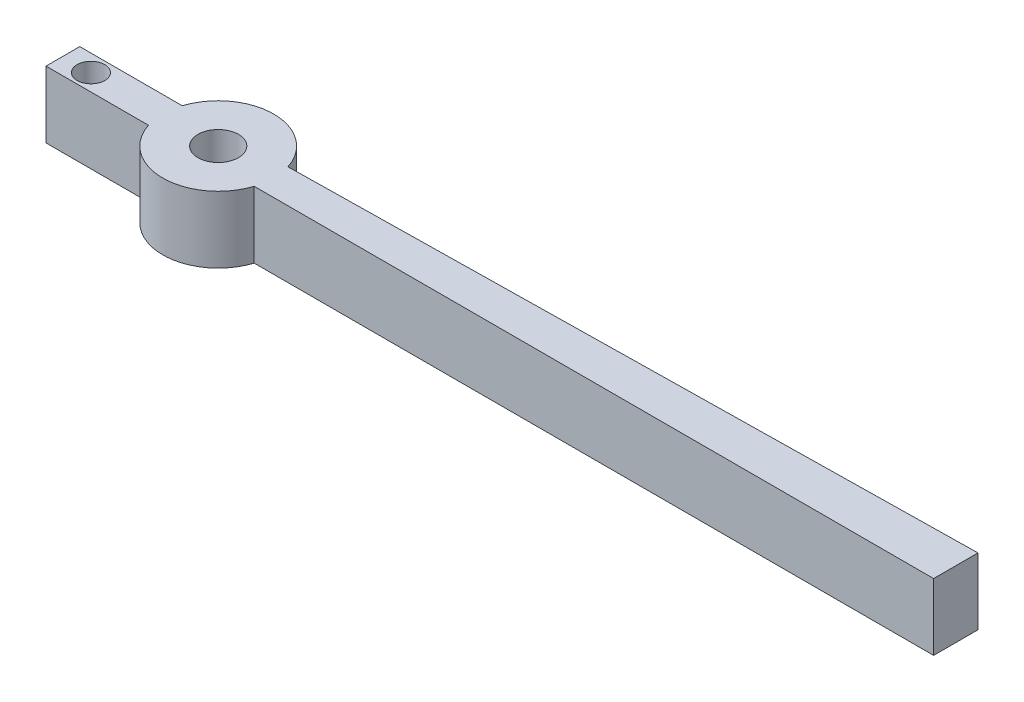
ISO-10303-21;
HEADER;
FILE_DESCRIPTION(('STEP AP214'),'2;1');
FILE_NAME('part.step','',(''),(''),'','','');
FILE_SCHEMA(('AUTOMOTIVE_DESIGN { 1 0 10303 214 1 1 1 1 }'));
ENDSEC;
DATA;
#1=APPLICATION_CONTEXT('core data for automotive mechanical design processes');
#2=APPLICATION_PROTOCOL_DEFINITION('international standard','automotive_design',2000,#1);
#3=PRODUCT_CONTEXT('',#1,'mechanical');
#4=PRODUCT('Part','Part','',(#3));
#5=PRODUCT_RELATED_PRODUCT_CATEGORY('part','',(#4));
#6=PRODUCT_DEFINITION_FORMATION('','',#4);
#7=PRODUCT_DEFINITION_CONTEXT('part definition',#1,'design');
#8=PRODUCT_DEFINITION('design','',#6,#7);
#9=PRODUCT_DEFINITION_SHAPE('','',#8);
#10=(LENGTH_UNIT() NAMED_UNIT(*) SI_UNIT(.MILLI.,.METRE.));
#11=(NAMED_UNIT(*) PLANE_ANGLE_UNIT() SI_UNIT($,.RADIAN.));
#12=(NAMED_UNIT(*) SI_UNIT($,.STERADIAN.) SOLID_ANGLE_UNIT());
#13=UNCERTAINTY_MEASURE_WITH_UNIT(LENGTH_MEASURE(1.E-05),#10,'distance_accuracy_value','');
#14=(GEOMETRIC_REPRESENTATION_CONTEXT(3) GLOBAL_UNCERTAINTY_ASSIGNED_CONTEXT((#13)) GLOBAL_UNIT_ASSIGNED_CONTEXT((#10,
#11,#12)) REPRESENTATION_CONTEXT('',''));
#15=CARTESIAN_POINT('',(0.,0.,0.));
#16=DIRECTION('',(0.,0.,1.));
#17=DIRECTION('',(1.,0.,0.));
#18=AXIS2_PLACEMENT_3D('',#15,#16,#17);
#19=CARTESIAN_POINT('',(-194.484920724261,-15.,50.304604358839));
#20=DIRECTION('',(-1.,0.,0.));
#21=DIRECTION('',(0.,0.,1.));
#22=AXIS2_PLACEMENT_3D('',#19,#20,#21);
#23=PLANE('',#22);
#24=DIRECTION('',(0.,1.,0.));
#25=VECTOR('',#24,1.);
#26=CARTESIAN_POINT('',(-194.484920724261,-15.,65.5234657039711));
#27=LINE('',#26,#25);
#28=CARTESIAN_POINT('',(-194.484920724261,-15.,65.5234657039711));
#29=VERTEX_POINT('',#28);
#30=CARTESIAN_POINT('',(-194.484920724261,15.,65.5234657039711));
#31=VERTEX_POINT('',#30);
#32=EDGE_CURVE('E36',#29,#31,#27,.T.);
#33=ORIENTED_EDGE('',*,*,#32,.T.);
#34=DIRECTION('',(0.,0.,1.));
#35=VECTOR('',#34,1.);
#36=CARTESIAN_POINT('',(-194.484920724261,15.,50.304604358839));
#37=LINE('',#36,#35);
#38=CARTESIAN_POINT('',(-194.484920724261,15.,50.304604358839));
#39=VERTEX_POINT('',#38);
#40=EDGE_CURVE('E97',#39,#31,#37,.T.);
#41=ORIENTED_EDGE('',*,*,#40,.F.);
#42=DIRECTION('',(0.,1.,0.));
#43=VECTOR('',#42,1.);
#44=CARTESIAN_POINT('',(-194.484920724261,-15.,50.304604358839));
#45=LINE('',#44,#43);
#46=CARTESIAN_POINT('',(-194.484920724261,-15.,50.304604358839));
#47=VERTEX_POINT('',#46);
#48=EDGE_CURVE('E11',#47,#39,#45,.T.);
#49=ORIENTED_EDGE('',*,*,#48,.F.);
#50=DIRECTION('',(0.,0.,1.));
#51=VECTOR('',#50,1.);
#52=CARTESIAN_POINT('',(-194.484920724261,-15.,50.304604358839));
#53=LINE('',#52,#51);
#54=EDGE_CURVE('E98',#47,#29,#53,.T.);
#55=ORIENTED_EDGE('',*,*,#54,.T.);
#56=EDGE_LOOP('',(#33,#41,#49,#55));
#57=FACE_BOUND('',#56,.T.);
#58=ADVANCED_FACE('F33',(#57),#23,.T.);
#59=CARTESIAN_POINT('',(-194.484920724261,-15.,50.304604358839));
#60=DIRECTION('',(0.,0.,-1.));
#61=DIRECTION('',(-1.,0.,0.));
#62=AXIS2_PLACEMENT_3D('',#59,#60,#61);
#63=PLANE('',#62);
#64=ORIENTED_EDGE('',*,*,#48,.T.);
#65=DIRECTION('',(-1.,0.,0.));
#66=VECTOR('',#65,1.);
#67=CARTESIAN_POINT('',(-194.484920724261,15.,50.304604358839));
#68=LINE('',#67,#66);
#69=CARTESIAN_POINT('',(-148.298710108553,15.,50.304604358839));
#70=VERTEX_POINT('',#69);
#71=EDGE_CURVE('E116',#70,#39,#68,.T.);
#72=ORIENTED_EDGE('',*,*,#71,.F.);
#73=DIRECTION('',(0.,1.,0.));
#74=VECTOR('',#73,1.);
#75=CARTESIAN_POINT('',(-148.298710108553,-15.,50.304604358839));
#76=LINE('',#75,#74);
#77=CARTESIAN_POINT('',(-148.298710108553,-15.,50.304604358839));
#78=VERTEX_POINT('',#77);
#79=EDGE_CURVE('E41',#78,#70,#76,.T.);
#80=ORIENTED_EDGE('',*,*,#79,.F.);
#81=DIRECTION('',(-1.,0.,0.));
#82=VECTOR('',#81,1.);
#83=CARTESIAN_POINT('',(-194.484920724261,-15.,50.304604358839));
#84=LINE('',#83,#82);
#85=EDGE_CURVE('E103',#78,#47,#84,.T.);
#86=ORIENTED_EDGE('',*,*,#85,.T.);
#87=EDGE_LOOP('',(#64,#72,#80,#86));
#88=FACE_BOUND('',#87,.T.);
#89=ADVANCED_FACE('F191',(#88),#63,.T.);
#90=CARTESIAN_POINT('',(-124.484920724261,-15.,57.9140350314051));
#91=DIRECTION('',(0.,1.,0.));
#92=DIRECTION('',(0.,0.,1.));
#93=AXIS2_PLACEMENT_3D('',#90,#91,#92);
#94=CYLINDRICAL_SURFACE('',#93,25.);
#95=ORIENTED_EDGE('',*,*,#79,.T.);
#96=CARTESIAN_POINT('',(-124.484920724261,15.,57.9140350314051));
#97=DIRECTION('',(0.,1.,0.));
#98=DIRECTION('',(0.,0.,1.));
#99=AXIS2_PLACEMENT_3D('',#96,#97,#98);
#100=CIRCLE('',#99,25.);
#101=CARTESIAN_POINT('',(-100.671131339969,15.,50.304604358839));
#102=VERTEX_POINT('',#101);
#103=EDGE_CURVE('E134',#102,#70,#100,.T.);
#104=ORIENTED_EDGE('',*,*,#103,.F.);
#105=DIRECTION('',(0.,1.,0.));
#106=VECTOR('',#105,1.);
#107=CARTESIAN_POINT('',(-100.671131339969,-15.,50.304604358839));
#108=LINE('',#107,#106);
#109=CARTESIAN_POINT('',(-100.671131339969,-15.,50.304604358839));
#110=VERTEX_POINT('',#109);
#111=EDGE_CURVE('E162',#110,#102,#108,.T.);
#112=ORIENTED_EDGE('',*,*,#111,.F.);
#113=CARTESIAN_POINT('',(-124.484920724261,-15.,57.9140350314051));
#114=DIRECTION('',(0.,1.,0.));
#115=DIRECTION('',(0.,0.,1.));
#116=AXIS2_PLACEMENT_3D('',#113,#114,#115);
#117=CIRCLE('',#116,25.);
#118=EDGE_CURVE('E158',#110,#78,#117,.T.);
#119=ORIENTED_EDGE('',*,*,#118,.T.);
#120=EDGE_LOOP('',(#95,#104,#112,#119));
#121=FACE_BOUND('',#120,.T.);
#122=ADVANCED_FACE('F190',(#121),#94,.T.);
#123=CARTESIAN_POINT('',(-100.671131339969,-15.,50.304604358839));
#124=DIRECTION('',(-0.0156132304376576,0.,-0.999878106088587));
#125=DIRECTION('',(-0.999878106088588,0.,0.0156132304376577));
#126=AXIS2_PLACEMENT_3D('',#123,#124,#125);
#127=PLANE('',#126);
#128=ORIENTED_EDGE('',*,*,#111,.T.);
#129=DIRECTION('',(-0.999878106088588,0.,0.0156132304376577));
#130=VECTOR('',#129,1.);
#131=CARTESIAN_POINT('',(-100.671131339969,15.,50.304604358839));
#132=LINE('',#131,#130);
#133=CARTESIAN_POINT('',(205.515079275739,15.,45.5234657039711));
#134=VERTEX_POINT('',#133);
#135=EDGE_CURVE('E131',#134,#102,#132,.T.);
#136=ORIENTED_EDGE('',*,*,#135,.F.);
#137=DIRECTION('',(0.,1.,0.));
#138=VECTOR('',#137,1.);
#139=CARTESIAN_POINT('',(205.515079275739,-15.,45.5234657039711));
#140=LINE('',#139,#138);
#141=CARTESIAN_POINT('',(205.515079275739,-15.,45.5234657039711));
#142=VERTEX_POINT('',#141);
#143=EDGE_CURVE('E164',#142,#134,#140,.T.);
#144=ORIENTED_EDGE('',*,*,#143,.F.);
#145=DIRECTION('',(-0.999878106088588,0.,0.0156132304376577));
#146=VECTOR('',#145,1.);
#147=CARTESIAN_POINT('',(-100.671131339969,-15.,50.304604358839));
#148=LINE('',#147,#146);
#149=EDGE_CURVE('E155',#142,#110,#148,.T.);
#150=ORIENTED_EDGE('',*,*,#149,.T.);
#151=EDGE_LOOP('',(#128,#136,#144,#150));
#152=FACE_BOUND('',#151,.T.);
#153=ADVANCED_FACE('F186',(#152),#127,.T.);
#154=CARTESIAN_POINT('',(205.515079275739,-15.,45.5234657039711));
#155=DIRECTION('',(1.,0.,0.));
#156=DIRECTION('',(0.,0.,-1.));
#157=AXIS2_PLACEMENT_3D('',#154,#155,#156);
#158=PLANE('',#157);
#159=ORIENTED_EDGE('',*,*,#143,.T.);
#160=DIRECTION('',(0.,0.,-1.));
#161=VECTOR('',#160,1.);
#162=CARTESIAN_POINT('',(205.515079275739,15.,45.5234657039711));
#163=LINE('',#162,#161);
#164=CARTESIAN_POINT('',(205.515079275739,15.,65.5234657039711));
#165=VERTEX_POINT('',#164);
#166=EDGE_CURVE('E128',#165,#134,#163,.T.);
#167=ORIENTED_EDGE('',*,*,#166,.F.);
#168=DIRECTION('',(0.,1.,0.));
#169=VECTOR('',#168,1.);
#170=CARTESIAN_POINT('',(205.515079275739,-15.,65.5234657039711));
#171=LINE('',#170,#169);
#172=CARTESIAN_POINT('',(205.515079275739,-15.,65.5234657039711));
#173=VERTEX_POINT('',#172);
#174=EDGE_CURVE('E166',#173,#165,#171,.T.);
#175=ORIENTED_EDGE('',*,*,#174,.F.);
#176=DIRECTION('',(0.,0.,-1.));
#177=VECTOR('',#176,1.);
#178=CARTESIAN_POINT('',(205.515079275739,-15.,45.5234657039711));
#179=LINE('',#178,#177);
#180=EDGE_CURVE('E152',#173,#142,#179,.T.);
#181=ORIENTED_EDGE('',*,*,#180,.T.);
#182=EDGE_LOOP('',(#159,#167,#175,#181));
#183=FACE_BOUND('',#182,.T.);
#184=ADVANCED_FACE('F179',(#183),#158,.T.);
#185=CARTESIAN_POINT('',(-100.671131339969,-15.,65.5234657039711));
#186=DIRECTION('',(0.,0.,1.));
#187=DIRECTION('',(1.,0.,0.));
#188=AXIS2_PLACEMENT_3D('',#185,#186,#187);
#189=PLANE('',#188);
#190=ORIENTED_EDGE('',*,*,#174,.T.);
#191=DIRECTION('',(1.,0.,0.));
#192=VECTOR('',#191,1.);
#193=CARTESIAN_POINT('',(-100.671131339969,15.,65.5234657039711));
#194=LINE('',#193,#192);
#195=CARTESIAN_POINT('',(-100.671131339969,15.,65.5234657039711));
#196=VERTEX_POINT('',#195);
#197=EDGE_CURVE('E125',#196,#165,#194,.T.);
#198=ORIENTED_EDGE('',*,*,#197,.F.);
#199=DIRECTION('',(0.,1.,0.));
#200=VECTOR('',#199,1.);
#201=CARTESIAN_POINT('',(-100.671131339969,-15.,65.5234657039711));
#202=LINE('',#201,#200);
#203=CARTESIAN_POINT('',(-100.671131339969,-15.,65.5234657039711));
#204=VERTEX_POINT('',#203);
#205=EDGE_CURVE('E168',#204,#196,#202,.T.);
#206=ORIENTED_EDGE('',*,*,#205,.F.);
#207=DIRECTION('',(1.,0.,0.));
#208=VECTOR('',#207,1.);
#209=CARTESIAN_POINT('',(-100.671131339969,-15.,65.5234657039711));
#210=LINE('',#209,#208);
#211=EDGE_CURVE('E149',#204,#173,#210,.T.);
#212=ORIENTED_EDGE('',*,*,#211,.T.);
#213=EDGE_LOOP('',(#190,#198,#206,#212));
#214=FACE_BOUND('',#213,.T.);
#215=ADVANCED_FACE('F176',(#214),#189,.T.);
#216=CARTESIAN_POINT('',(-124.484920724261,-15.,57.9140350314051));
#217=DIRECTION('',(0.,1.,0.));
#218=DIRECTION('',(0.,0.,1.));
#219=AXIS2_PLACEMENT_3D('',#216,#217,#218);
#220=CYLINDRICAL_SURFACE('',#219,25.);
#221=ORIENTED_EDGE('',*,*,#205,.T.);
#222=CARTESIAN_POINT('',(-124.484920724261,15.,57.9140350314051));
#223=DIRECTION('',(0.,1.,0.));
#224=DIRECTION('',(0.,0.,1.));
#225=AXIS2_PLACEMENT_3D('',#222,#223,#224);
#226=CIRCLE('',#225,25.);
#227=CARTESIAN_POINT('',(-148.298710108553,15.,65.5234657039711));
#228=VERTEX_POINT('',#227);
#229=EDGE_CURVE('E110',#228,#196,#226,.T.);
#230=ORIENTED_EDGE('',*,*,#229,.F.);
#231=DIRECTION('',(0.,1.,0.));
#232=VECTOR('',#231,1.);
#233=CARTESIAN_POINT('',(-148.298710108553,-15.,65.5234657039711));
#234=LINE('',#233,#232);
#235=CARTESIAN_POINT('',(-148.298710108553,-15.,65.5234657039711));
#236=VERTEX_POINT('',#235);
#237=EDGE_CURVE('E102',#236,#228,#234,.T.);
#238=ORIENTED_EDGE('',*,*,#237,.F.);
#239=CARTESIAN_POINT('',(-124.484920724261,-15.,57.9140350314051));
#240=DIRECTION('',(0.,1.,0.));
#241=DIRECTION('',(0.,0.,1.));
#242=AXIS2_PLACEMENT_3D('',#239,#240,#241);
#243=CIRCLE('',#242,25.);
#244=EDGE_CURVE('E146',#236,#204,#243,.T.);
#245=ORIENTED_EDGE('',*,*,#244,.T.);
#246=EDGE_LOOP('',(#221,#230,#238,#245));
#247=FACE_BOUND('',#246,.T.);
#248=ADVANCED_FACE('F170',(#247),#220,.T.);
#249=CARTESIAN_POINT('',(-194.484920724261,-15.,65.5234657039711));
#250=DIRECTION('',(0.,0.,1.));
#251=DIRECTION('',(1.,0.,0.));
#252=AXIS2_PLACEMENT_3D('',#249,#250,#251);
#253=PLANE('',#252);
#254=ORIENTED_EDGE('',*,*,#237,.T.);
#255=DIRECTION('',(1.,0.,0.));
#256=VECTOR('',#255,1.);
#257=CARTESIAN_POINT('',(-194.484920724261,15.,65.5234657039711));
#258=LINE('',#257,#256);
#259=EDGE_CURVE('E105',#31,#228,#258,.T.);
#260=ORIENTED_EDGE('',*,*,#259,.F.);
#261=ORIENTED_EDGE('',*,*,#32,.F.);
#262=DIRECTION('',(1.,0.,0.));
#263=VECTOR('',#262,1.);
#264=CARTESIAN_POINT('',(-194.484920724261,-15.,65.5234657039711));
#265=LINE('',#264,#263);
#266=EDGE_CURVE('E144',#29,#236,#265,.T.);
#267=ORIENTED_EDGE('',*,*,#266,.T.);
#268=EDGE_LOOP('',(#254,#260,#261,#267));
#269=FACE_BOUND('',#268,.T.);
#270=ADVANCED_FACE('F106',(#269),#253,.T.);
#271=CARTESIAN_POINT('',(-124.484920724261,-15.,57.9140350314051));
#272=DIRECTION('',(0.,1.,0.));
#273=DIRECTION('',(0.,0.,1.));
#274=AXIS2_PLACEMENT_3D('',#271,#272,#273);
#275=PLANE('',#274);
#276=CARTESIAN_POINT('',(-181.826571095183,-15.,57.9140350314051));
#277=DIRECTION('',(0.,1.,0.));
#278=DIRECTION('',(0.,0.,1.));
#279=AXIS2_PLACEMENT_3D('',#276,#277,#278);
#280=CIRCLE('',#279,6.23250541756961);
#281=CARTESIAN_POINT('',(-181.826571095183,-15.,64.1465404489747));
#282=VERTEX_POINT('',#281);
#283=EDGE_CURVE('E137',#282,#282,#280,.T.);
#284=ORIENTED_EDGE('',*,*,#283,.T.);
#285=EDGE_LOOP('',(#284));
#286=FACE_BOUND('',#285,.T.);
#287=CARTESIAN_POINT('',(-124.484920724261,-15.,57.9140350314051));
#288=DIRECTION('',(0.,1.,0.));
#289=DIRECTION('',(0.,0.,1.));
#290=AXIS2_PLACEMENT_3D('',#287,#288,#289);
#291=CIRCLE('',#290,9.12611675);
#292=CARTESIAN_POINT('',(-124.484920724261,-15.,67.0401517814051));
#293=VERTEX_POINT('',#292);
#294=EDGE_CURVE('E140',#293,#293,#291,.T.);
#295=ORIENTED_EDGE('',*,*,#294,.T.);
#296=EDGE_LOOP('',(#295));
#297=FACE_BOUND('',#296,.T.);
#298=ORIENTED_EDGE('',*,*,#54,.F.);
#299=ORIENTED_EDGE('',*,*,#85,.F.);
#300=ORIENTED_EDGE('',*,*,#118,.F.);
#301=ORIENTED_EDGE('',*,*,#149,.F.);
#302=ORIENTED_EDGE('',*,*,#180,.F.);
#303=ORIENTED_EDGE('',*,*,#211,.F.);
#304=ORIENTED_EDGE('',*,*,#244,.F.);
#305=ORIENTED_EDGE('',*,*,#266,.F.);
#306=EDGE_LOOP('',(#298,#299,#300,#301,#302,#303,#304,#305));
#307=FACE_BOUND('',#306,.T.);
#308=ADVANCED_FACE('F182',(#286,#297,#307),#275,.F.);
#309=CARTESIAN_POINT('',(-124.484920724261,-15.,57.9140350314051));
#310=DIRECTION('',(0.,1.,0.));
#311=DIRECTION('',(0.,0.,1.));
#312=AXIS2_PLACEMENT_3D('',#309,#310,#311);
#313=CYLINDRICAL_SURFACE('',#312,9.12611675);
#314=ORIENTED_EDGE('',*,*,#294,.F.);
#315=EDGE_LOOP('',(#314));
#316=FACE_BOUND('',#315,.T.);
#317=CARTESIAN_POINT('',(-124.484920724261,15.,57.9140350314051));
#318=DIRECTION('',(0.,1.,0.));
#319=DIRECTION('',(0.,0.,1.));
#320=AXIS2_PLACEMENT_3D('',#317,#318,#319);
#321=CIRCLE('',#320,9.12611675);
#322=CARTESIAN_POINT('',(-124.484920724261,15.,67.0401517814051));
#323=VERTEX_POINT('',#322);
#324=EDGE_CURVE('E117',#323,#323,#321,.T.);
#325=ORIENTED_EDGE('',*,*,#324,.T.);
#326=EDGE_LOOP('',(#325));
#327=FACE_BOUND('',#326,.T.);
#328=ADVANCED_FACE('F213',(#316,#327),#313,.F.);
#329=CARTESIAN_POINT('',(-181.826571095183,-15.,57.9140350314051));
#330=DIRECTION('',(0.,1.,0.));
#331=DIRECTION('',(0.,0.,1.));
#332=AXIS2_PLACEMENT_3D('',#329,#330,#331);
#333=CYLINDRICAL_SURFACE('',#332,6.23250541756961);
#334=ORIENTED_EDGE('',*,*,#283,.F.);
#335=EDGE_LOOP('',(#334));
#336=FACE_BOUND('',#335,.T.);
#337=CARTESIAN_POINT('',(-181.826571095183,15.,57.9140350314051));
#338=DIRECTION('',(0.,1.,0.));
#339=DIRECTION('',(0.,0.,1.));
#340=AXIS2_PLACEMENT_3D('',#337,#338,#339);
#341=CIRCLE('',#340,6.23250541756961);
#342=CARTESIAN_POINT('',(-181.826571095183,15.,64.1465404489747));
#343=VERTEX_POINT('',#342);
#344=EDGE_CURVE('E120',#343,#343,#341,.T.);
#345=ORIENTED_EDGE('',*,*,#344,.T.);
#346=EDGE_LOOP('',(#345));
#347=FACE_BOUND('',#346,.T.);
#348=ADVANCED_FACE('F218',(#336,#347),#333,.F.);
#349=CARTESIAN_POINT('',(-124.484920724261,15.,57.9140350314051));
#350=DIRECTION('',(0.,1.,0.));
#351=DIRECTION('',(0.,0.,1.));
#352=AXIS2_PLACEMENT_3D('',#349,#350,#351);
#353=PLANE('',#352);
#354=ORIENTED_EDGE('',*,*,#324,.F.);
#355=EDGE_LOOP('',(#354));
#356=FACE_BOUND('',#355,.T.);
#357=ORIENTED_EDGE('',*,*,#40,.T.);
#358=ORIENTED_EDGE('',*,*,#259,.T.);
#359=ORIENTED_EDGE('',*,*,#229,.T.);
#360=ORIENTED_EDGE('',*,*,#197,.T.);
#361=ORIENTED_EDGE('',*,*,#166,.T.);
#362=ORIENTED_EDGE('',*,*,#135,.T.);
#363=ORIENTED_EDGE('',*,*,#103,.T.);
#364=ORIENTED_EDGE('',*,*,#71,.T.);
#365=EDGE_LOOP('',(#357,#358,#359,#360,#361,#362,#363,#364));
#366=FACE_BOUND('',#365,.T.);
#367=ORIENTED_EDGE('',*,*,#344,.F.);
#368=EDGE_LOOP('',(#367));
#369=FACE_BOUND('',#368,.T.);
#370=ADVANCED_FACE('F113',(#356,#366,#369),#353,.T.);
#371=CLOSED_SHELL('',(#58,#89,#122,#153,#184,#215,#248,#270,#308,#328,#348,#370));
#372=MANIFOLD_SOLID_BREP('B2',#371);
#373=ADVANCED_BREP_SHAPE_REPRESENTATION('',(#18,#372),#14);
#374=SHAPE_DEFINITION_REPRESENTATION(#9,#373);
ENDSEC;
END-ISO-10303-21;
